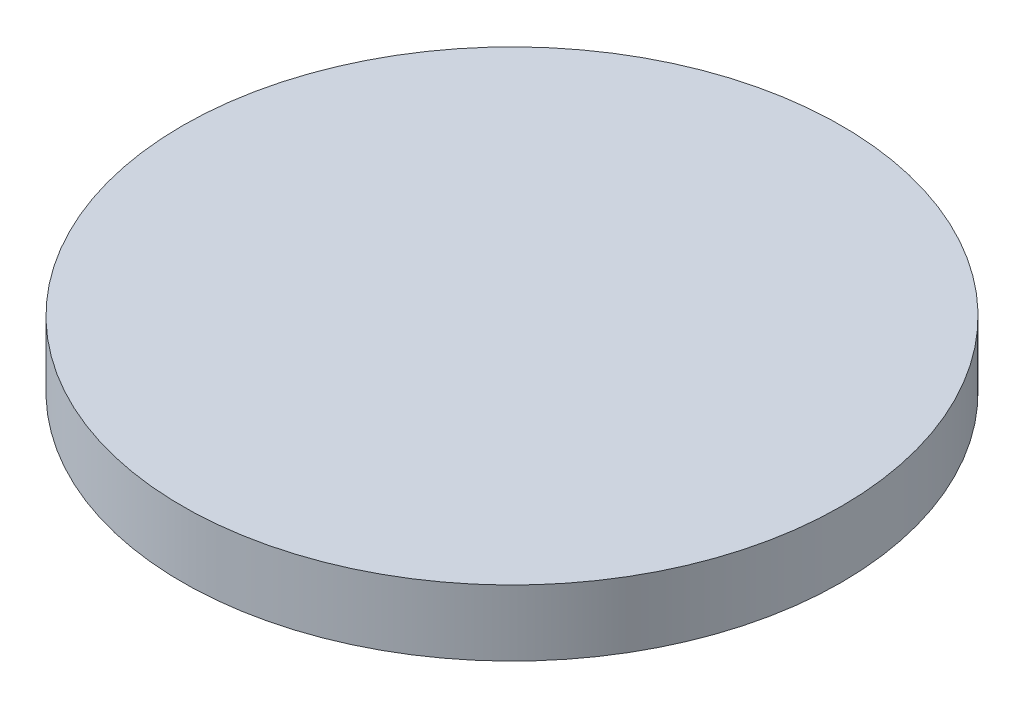
ISO-10303-21;
HEADER;
FILE_DESCRIPTION(('STEP AP214'),'2;1');
FILE_NAME('part.step','',(''),(''),'','','');
FILE_SCHEMA(('AUTOMOTIVE_DESIGN { 1 0 10303 214 1 1 1 1 }'));
ENDSEC;
DATA;
#1=APPLICATION_CONTEXT('core data for automotive mechanical design processes');
#2=APPLICATION_PROTOCOL_DEFINITION('international standard','automotive_design',2000,#1);
#3=PRODUCT_CONTEXT('',#1,'mechanical');
#4=PRODUCT('Part','Part','',(#3));
#5=PRODUCT_RELATED_PRODUCT_CATEGORY('part','',(#4));
#6=PRODUCT_DEFINITION_FORMATION('','',#4);
#7=PRODUCT_DEFINITION_CONTEXT('part definition',#1,'design');
#8=PRODUCT_DEFINITION('design','',#6,#7);
#9=PRODUCT_DEFINITION_SHAPE('','',#8);
#10=(LENGTH_UNIT() NAMED_UNIT(*) SI_UNIT(.MILLI.,.METRE.));
#11=(NAMED_UNIT(*) PLANE_ANGLE_UNIT() SI_UNIT($,.RADIAN.));
#12=(NAMED_UNIT(*) SI_UNIT($,.STERADIAN.) SOLID_ANGLE_UNIT());
#13=UNCERTAINTY_MEASURE_WITH_UNIT(LENGTH_MEASURE(1.E-05),#10,'distance_accuracy_value','');
#14=(GEOMETRIC_REPRESENTATION_CONTEXT(3) GLOBAL_UNCERTAINTY_ASSIGNED_CONTEXT((#13)) GLOBAL_UNIT_ASSIGNED_CONTEXT((#10,
#11,#12)) REPRESENTATION_CONTEXT('',''));
#15=CARTESIAN_POINT('',(0.,0.,0.));
#16=DIRECTION('',(0.,0.,1.));
#17=DIRECTION('',(1.,0.,0.));
#18=AXIS2_PLACEMENT_3D('',#15,#16,#17);
#19=CARTESIAN_POINT('',(252.5,26.8959813156576,27.1730927237417));
#20=DIRECTION('',(0.,1.,0.));
#21=DIRECTION('',(-1.,0.,0.));
#22=AXIS2_PLACEMENT_3D('',#19,#20,#21);
#23=CYLINDRICAL_SURFACE('',#22,15.);
#24=CARTESIAN_POINT('',(252.5,26.8959813156576,27.1730927237417));
#25=DIRECTION('',(0.,-1.,0.));
#26=DIRECTION('',(1.,0.,0.));
#27=AXIS2_PLACEMENT_3D('',#24,#25,#26);
#28=CIRCLE('',#27,15.);
#29=CARTESIAN_POINT('',(267.5,26.8959813156576,27.1730927237417));
#30=VERTEX_POINT('',#29);
#31=EDGE_CURVE('E10',#30,#30,#28,.T.);
#32=ORIENTED_EDGE('',*,*,#31,.F.);
#33=EDGE_LOOP('',(#32));
#34=FACE_BOUND('',#33,.T.);
#35=CARTESIAN_POINT('',(252.5,29.8959813156576,27.1730927237417));
#36=DIRECTION('',(0.,-1.,0.));
#37=DIRECTION('',(1.,0.,0.));
#38=AXIS2_PLACEMENT_3D('',#35,#36,#37);
#39=CIRCLE('',#38,15.);
#40=CARTESIAN_POINT('',(267.5,29.8959813156576,27.1730927237417));
#41=VERTEX_POINT('',#40);
#42=EDGE_CURVE('E48',#41,#41,#39,.T.);
#43=ORIENTED_EDGE('',*,*,#42,.T.);
#44=EDGE_LOOP('',(#43));
#45=FACE_BOUND('',#44,.T.);
#46=ADVANCED_FACE('F45',(#34,#45),#23,.T.);
#47=CARTESIAN_POINT('',(0.,26.8959813156576,0.));
#48=DIRECTION('',(0.,-1.,0.));
#49=DIRECTION('',(1.,0.,0.));
#50=AXIS2_PLACEMENT_3D('',#47,#48,#49);
#51=PLANE('',#50);
#52=CARTESIAN_POINT('',(252.5,26.8959813156576,27.1730927237417));
#53=DIRECTION('',(0.,-1.,0.));
#54=DIRECTION('',(1.,0.,0.));
#55=AXIS2_PLACEMENT_3D('',#52,#53,#54);
#56=CIRCLE('',#55,12.5);
#57=CARTESIAN_POINT('',(265.,26.8959813156576,27.1730927237417));
#58=VERTEX_POINT('',#57);
#59=EDGE_CURVE('E57',#58,#58,#56,.T.);
#60=ORIENTED_EDGE('',*,*,#59,.F.);
#61=EDGE_LOOP('',(#60));
#62=FACE_BOUND('',#61,.T.);
#63=ORIENTED_EDGE('',*,*,#31,.T.);
#64=EDGE_LOOP('',(#63));
#65=FACE_BOUND('',#64,.T.);
#66=ADVANCED_FACE('F72',(#62,#65),#51,.T.);
#67=CARTESIAN_POINT('',(0.,29.8959813156576,0.));
#68=DIRECTION('',(0.,-1.,0.));
#69=DIRECTION('',(1.,0.,0.));
#70=AXIS2_PLACEMENT_3D('',#67,#68,#69);
#71=PLANE('',#70);
#72=ORIENTED_EDGE('',*,*,#42,.F.);
#73=EDGE_LOOP('',(#72));
#74=FACE_BOUND('',#73,.T.);
#75=ADVANCED_FACE('F68',(#74),#71,.F.);
#76=CARTESIAN_POINT('',(252.5,28.8959813156576,27.1730927237417));
#77=DIRECTION('',(0.,-1.,0.));
#78=DIRECTION('',(1.,0.,0.));
#79=AXIS2_PLACEMENT_3D('',#76,#77,#78);
#80=CYLINDRICAL_SURFACE('',#79,12.5);
#81=CARTESIAN_POINT('',(252.5,28.8959813156576,27.1730927237417));
#82=DIRECTION('',(0.,-1.,0.));
#83=DIRECTION('',(1.,0.,0.));
#84=AXIS2_PLACEMENT_3D('',#81,#82,#83);
#85=CIRCLE('',#84,12.5);
#86=CARTESIAN_POINT('',(265.,28.8959813156576,27.1730927237417));
#87=VERTEX_POINT('',#86);
#88=EDGE_CURVE('E55',#87,#87,#85,.T.);
#89=ORIENTED_EDGE('',*,*,#88,.F.);
#90=EDGE_LOOP('',(#89));
#91=FACE_BOUND('',#90,.T.);
#92=ORIENTED_EDGE('',*,*,#59,.T.);
#93=EDGE_LOOP('',(#92));
#94=FACE_BOUND('',#93,.T.);
#95=ADVANCED_FACE('F65',(#91,#94),#80,.F.);
#96=CARTESIAN_POINT('',(252.5,28.8959813156576,27.1730927237417));
#97=DIRECTION('',(0.,-1.,0.));
#98=DIRECTION('',(1.,0.,0.));
#99=AXIS2_PLACEMENT_3D('',#96,#97,#98);
#100=PLANE('',#99);
#101=ORIENTED_EDGE('',*,*,#88,.T.);
#102=EDGE_LOOP('',(#101));
#103=FACE_BOUND('',#102,.T.);
#104=ADVANCED_FACE('F63',(#103),#100,.T.);
#105=CLOSED_SHELL('',(#46,#66,#75,#95,#104));
#106=MANIFOLD_SOLID_BREP('B2',#105);
#107=ADVANCED_BREP_SHAPE_REPRESENTATION('',(#18,#106),#14);
#108=SHAPE_DEFINITION_REPRESENTATION(#9,#107);
ENDSEC;
END-ISO-10303-21;
